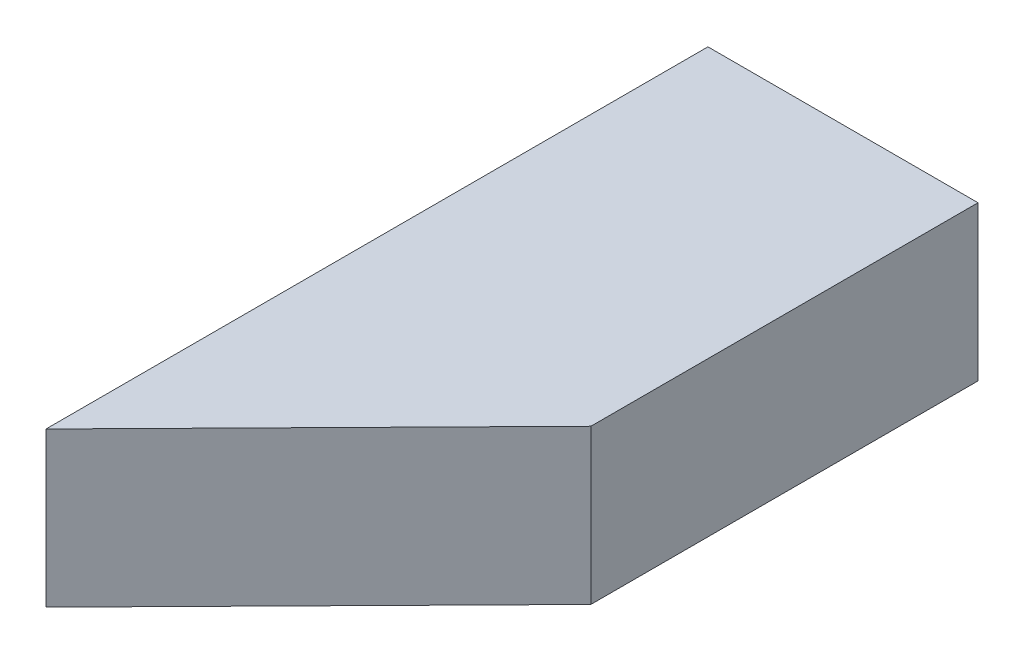
ISO-10303-21;
HEADER;
FILE_DESCRIPTION(('STEP AP214'),'2;1');
FILE_NAME('part.step','',(''),(''),'','','');
FILE_SCHEMA(('AUTOMOTIVE_DESIGN { 1 0 10303 214 1 1 1 1 }'));
ENDSEC;
DATA;
#1=APPLICATION_CONTEXT('core data for automotive mechanical design processes');
#2=APPLICATION_PROTOCOL_DEFINITION('international standard','automotive_design',2000,#1);
#3=PRODUCT_CONTEXT('',#1,'mechanical');
#4=PRODUCT('Part','Part','',(#3));
#5=PRODUCT_RELATED_PRODUCT_CATEGORY('part','',(#4));
#6=PRODUCT_DEFINITION_FORMATION('','',#4);
#7=PRODUCT_DEFINITION_CONTEXT('part definition',#1,'design');
#8=PRODUCT_DEFINITION('design','',#6,#7);
#9=PRODUCT_DEFINITION_SHAPE('','',#8);
#10=(LENGTH_UNIT() NAMED_UNIT(*) SI_UNIT(.MILLI.,.METRE.));
#11=(NAMED_UNIT(*) PLANE_ANGLE_UNIT() SI_UNIT($,.RADIAN.));
#12=(NAMED_UNIT(*) SI_UNIT($,.STERADIAN.) SOLID_ANGLE_UNIT());
#13=UNCERTAINTY_MEASURE_WITH_UNIT(LENGTH_MEASURE(1.E-05),#10,'distance_accuracy_value','');
#14=(GEOMETRIC_REPRESENTATION_CONTEXT(3) GLOBAL_UNCERTAINTY_ASSIGNED_CONTEXT((#13)) GLOBAL_UNIT_ASSIGNED_CONTEXT((#10,
#11,#12)) REPRESENTATION_CONTEXT('',''));
#15=CARTESIAN_POINT('',(0.,0.,0.));
#16=DIRECTION('',(0.,0.,1.));
#17=DIRECTION('',(1.,0.,0.));
#18=AXIS2_PLACEMENT_3D('',#15,#16,#17);
#19=CARTESIAN_POINT('',(0.,0.,127.42951908));
#20=DIRECTION('',(1.,0.,0.));
#21=DIRECTION('',(0.,0.,-1.));
#22=AXIS2_PLACEMENT_3D('',#19,#20,#21);
#23=PLANE('',#22);
#24=DIRECTION('',(0.,-1.,0.));
#25=VECTOR('',#24,1.);
#26=CARTESIAN_POINT('',(0.,0.,0.));
#27=LINE('',#26,#25);
#28=CARTESIAN_POINT('',(0.,50.8,0.));
#29=VERTEX_POINT('',#28);
#30=CARTESIAN_POINT('',(0.,0.,0.));
#31=VERTEX_POINT('',#30);
#32=EDGE_CURVE('E91',#29,#31,#27,.T.);
#33=ORIENTED_EDGE('',*,*,#32,.T.);
#34=DIRECTION('',(0.,0.,-1.));
#35=VECTOR('',#34,1.);
#36=CARTESIAN_POINT('',(0.,0.,127.42951908));
#37=LINE('',#36,#35);
#38=CARTESIAN_POINT('',(0.,0.,217.894816315221));
#39=VERTEX_POINT('',#38);
#40=EDGE_CURVE('E11',#39,#31,#37,.T.);
#41=ORIENTED_EDGE('',*,*,#40,.F.);
#42=DIRECTION('',(0.,1.,0.));
#43=VECTOR('',#42,1.);
#44=CARTESIAN_POINT('',(0.,-126.835247482145,217.894816315221));
#45=LINE('',#44,#43);
#46=CARTESIAN_POINT('',(0.,50.8,217.894816315221));
#47=VERTEX_POINT('',#46);
#48=EDGE_CURVE('E93',#39,#47,#45,.T.);
#49=ORIENTED_EDGE('',*,*,#48,.T.);
#50=DIRECTION('',(0.,0.,-1.));
#51=VECTOR('',#50,1.);
#52=CARTESIAN_POINT('',(0.,50.8,127.42951908));
#53=LINE('',#52,#51);
#54=EDGE_CURVE('E81',#47,#29,#53,.T.);
#55=ORIENTED_EDGE('',*,*,#54,.T.);
#56=EDGE_LOOP('',(#33,#41,#49,#55));
#57=FACE_BOUND('',#56,.T.);
#58=ADVANCED_FACE('F39',(#57),#23,.F.);
#59=CARTESIAN_POINT('',(0.,0.,127.42951908));
#60=DIRECTION('',(0.,1.,0.));
#61=DIRECTION('',(0.,0.,1.));
#62=AXIS2_PLACEMENT_3D('',#59,#60,#61);
#63=PLANE('',#62);
#64=DIRECTION('',(1.,0.,0.));
#65=VECTOR('',#64,1.);
#66=CARTESIAN_POINT('',(0.,0.,0.));
#67=LINE('',#66,#65);
#68=CARTESIAN_POINT('',(88.9,0.,0.));
#69=VERTEX_POINT('',#68);
#70=EDGE_CURVE('E98',#31,#69,#67,.T.);
#71=ORIENTED_EDGE('',*,*,#70,.T.);
#72=DIRECTION('',(0.,0.,-1.));
#73=VECTOR('',#72,1.);
#74=CARTESIAN_POINT('',(88.9,0.,127.42951908));
#75=LINE('',#74,#73);
#76=CARTESIAN_POINT('',(88.9,0.,127.42951908));
#77=VERTEX_POINT('',#76);
#78=EDGE_CURVE('E48',#77,#69,#75,.T.);
#79=ORIENTED_EDGE('',*,*,#78,.F.);
#80=DIRECTION('',(-0.700909264299855,0.,0.713250449154178));
#81=VECTOR('',#80,1.);
#82=CARTESIAN_POINT('',(0.,0.,217.894816315221));
#83=LINE('',#82,#81);
#84=EDGE_CURVE('E100',#77,#39,#83,.T.);
#85=ORIENTED_EDGE('',*,*,#84,.T.);
#86=ORIENTED_EDGE('',*,*,#40,.T.);
#87=EDGE_LOOP('',(#71,#79,#85,#86));
#88=FACE_BOUND('',#87,.T.);
#89=ADVANCED_FACE('F117',(#88),#63,.F.);
#90=CARTESIAN_POINT('',(88.9,0.,127.42951908));
#91=DIRECTION('',(-1.,0.,0.));
#92=DIRECTION('',(0.,0.,1.));
#93=AXIS2_PLACEMENT_3D('',#90,#91,#92);
#94=PLANE('',#93);
#95=DIRECTION('',(0.,1.,0.));
#96=VECTOR('',#95,1.);
#97=CARTESIAN_POINT('',(88.9,0.,0.));
#98=LINE('',#97,#96);
#99=CARTESIAN_POINT('',(88.9,50.8,0.));
#100=VERTEX_POINT('',#99);
#101=EDGE_CURVE('E71',#69,#100,#98,.T.);
#102=ORIENTED_EDGE('',*,*,#101,.T.);
#103=DIRECTION('',(0.,0.,-1.));
#104=VECTOR('',#103,1.);
#105=CARTESIAN_POINT('',(88.9,50.8,127.42951908));
#106=LINE('',#105,#104);
#107=CARTESIAN_POINT('',(88.9,50.8,127.42951908));
#108=VERTEX_POINT('',#107);
#109=EDGE_CURVE('E56',#108,#100,#106,.T.);
#110=ORIENTED_EDGE('',*,*,#109,.F.);
#111=DIRECTION('',(0.,1.,0.));
#112=VECTOR('',#111,1.);
#113=CARTESIAN_POINT('',(88.9,0.,127.42951908));
#114=LINE('',#113,#112);
#115=EDGE_CURVE('E86',#77,#108,#114,.T.);
#116=ORIENTED_EDGE('',*,*,#115,.F.);
#117=ORIENTED_EDGE('',*,*,#78,.T.);
#118=EDGE_LOOP('',(#102,#110,#116,#117));
#119=FACE_BOUND('',#118,.T.);
#120=ADVANCED_FACE('F114',(#119),#94,.F.);
#121=CARTESIAN_POINT('',(0.,50.8,127.42951908));
#122=DIRECTION('',(0.,-1.,0.));
#123=DIRECTION('',(0.,0.,-1.));
#124=AXIS2_PLACEMENT_3D('',#121,#122,#123);
#125=PLANE('',#124);
#126=DIRECTION('',(-1.,0.,0.));
#127=VECTOR('',#126,1.);
#128=CARTESIAN_POINT('',(0.,50.8,0.));
#129=LINE('',#128,#127);
#130=EDGE_CURVE('E76',#100,#29,#129,.T.);
#131=ORIENTED_EDGE('',*,*,#130,.T.);
#132=ORIENTED_EDGE('',*,*,#54,.F.);
#133=DIRECTION('',(0.700909264299855,0.,-0.713250449154178));
#134=VECTOR('',#133,1.);
#135=CARTESIAN_POINT('',(0.,50.8,217.894816315221));
#136=LINE('',#135,#134);
#137=EDGE_CURVE('E121',#47,#108,#136,.T.);
#138=ORIENTED_EDGE('',*,*,#137,.T.);
#139=ORIENTED_EDGE('',*,*,#109,.T.);
#140=EDGE_LOOP('',(#131,#132,#138,#139));
#141=FACE_BOUND('',#140,.T.);
#142=ADVANCED_FACE('F78',(#141),#125,.F.);
#143=CARTESIAN_POINT('',(0.,0.,0.));
#144=DIRECTION('',(0.,0.,-1.));
#145=DIRECTION('',(-1.,0.,0.));
#146=AXIS2_PLACEMENT_3D('',#143,#144,#145);
#147=PLANE('',#146);
#148=ORIENTED_EDGE('',*,*,#32,.F.);
#149=ORIENTED_EDGE('',*,*,#130,.F.);
#150=ORIENTED_EDGE('',*,*,#101,.F.);
#151=ORIENTED_EDGE('',*,*,#70,.F.);
#152=EDGE_LOOP('',(#148,#149,#150,#151));
#153=FACE_BOUND('',#152,.T.);
#154=ADVANCED_FACE('F97',(#153),#147,.T.);
#155=CARTESIAN_POINT('',(0.,-126.835247482145,217.894816315221));
#156=DIRECTION('',(0.713250449154178,0.,0.700909264299855));
#157=DIRECTION('',(0.700909264299855,0.,-0.713250449154178));
#158=AXIS2_PLACEMENT_3D('',#155,#156,#157);
#159=PLANE('',#158);
#160=ORIENTED_EDGE('',*,*,#84,.F.);
#161=ORIENTED_EDGE('',*,*,#115,.T.);
#162=ORIENTED_EDGE('',*,*,#137,.F.);
#163=ORIENTED_EDGE('',*,*,#48,.F.);
#164=EDGE_LOOP('',(#160,#161,#162,#163));
#165=FACE_BOUND('',#164,.T.);
#166=ADVANCED_FACE('F120',(#165),#159,.T.);
#167=CLOSED_SHELL('',(#58,#89,#120,#142,#154,#166));
#168=MANIFOLD_SOLID_BREP('B2',#167);
#169=ADVANCED_BREP_SHAPE_REPRESENTATION('',(#18,#168),#14);
#170=SHAPE_DEFINITION_REPRESENTATION(#9,#169);
ENDSEC;
END-ISO-10303-21;
